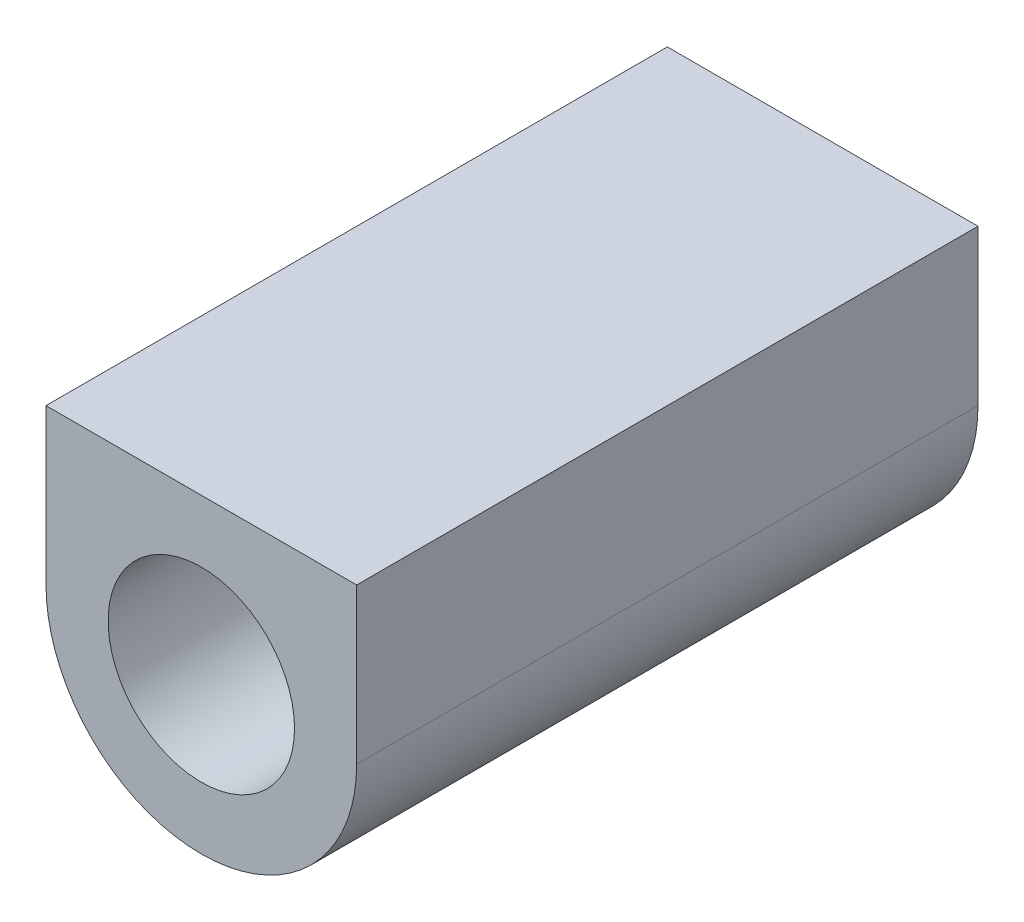
ISO-10303-21;
HEADER;
FILE_DESCRIPTION(('STEP AP214'),'2;1');
FILE_NAME('part.step','',(''),(''),'','','');
FILE_SCHEMA(('AUTOMOTIVE_DESIGN { 1 0 10303 214 1 1 1 1 }'));
ENDSEC;
DATA;
#1=APPLICATION_CONTEXT('core data for automotive mechanical design processes');
#2=APPLICATION_PROTOCOL_DEFINITION('international standard','automotive_design',2000,#1);
#3=PRODUCT_CONTEXT('',#1,'mechanical');
#4=PRODUCT('Part','Part','',(#3));
#5=PRODUCT_RELATED_PRODUCT_CATEGORY('part','',(#4));
#6=PRODUCT_DEFINITION_FORMATION('','',#4);
#7=PRODUCT_DEFINITION_CONTEXT('part definition',#1,'design');
#8=PRODUCT_DEFINITION('design','',#6,#7);
#9=PRODUCT_DEFINITION_SHAPE('','',#8);
#10=(LENGTH_UNIT() NAMED_UNIT(*) SI_UNIT(.MILLI.,.METRE.));
#11=(NAMED_UNIT(*) PLANE_ANGLE_UNIT() SI_UNIT($,.RADIAN.));
#12=(NAMED_UNIT(*) SI_UNIT($,.STERADIAN.) SOLID_ANGLE_UNIT());
#13=UNCERTAINTY_MEASURE_WITH_UNIT(LENGTH_MEASURE(1.E-05),#10,'distance_accuracy_value','');
#14=(GEOMETRIC_REPRESENTATION_CONTEXT(3) GLOBAL_UNCERTAINTY_ASSIGNED_CONTEXT((#13)) GLOBAL_UNIT_ASSIGNED_CONTEXT((#10,
#11,#12)) REPRESENTATION_CONTEXT('',''));
#15=CARTESIAN_POINT('',(0.,0.,0.));
#16=DIRECTION('',(0.,0.,1.));
#17=DIRECTION('',(1.,0.,0.));
#18=AXIS2_PLACEMENT_3D('',#15,#16,#17);
#19=CARTESIAN_POINT('',(0.,0.,10.));
#20=DIRECTION('',(0.,0.,-1.));
#21=DIRECTION('',(-1.,0.,0.));
#22=AXIS2_PLACEMENT_3D('',#19,#20,#21);
#23=PLANE('',#22);
#24=CARTESIAN_POINT('',(2.5,2.5,10.));
#25=DIRECTION('',(0.,0.,1.));
#26=DIRECTION('',(1.,0.,0.));
#27=AXIS2_PLACEMENT_3D('',#24,#25,#26);
#28=CIRCLE('',#27,1.5);
#29=CARTESIAN_POINT('',(4.,2.5,10.));
#30=VERTEX_POINT('',#29);
#31=EDGE_CURVE('E143',#30,#30,#28,.T.);
#32=ORIENTED_EDGE('',*,*,#31,.F.);
#33=EDGE_LOOP('',(#32));
#34=FACE_BOUND('',#33,.T.);
#35=DIRECTION('',(0.,-1.,0.));
#36=VECTOR('',#35,1.);
#37=CARTESIAN_POINT('',(0.,0.,10.));
#38=LINE('',#37,#36);
#39=CARTESIAN_POINT('',(0.,5.,10.));
#40=VERTEX_POINT('',#39);
#41=CARTESIAN_POINT('',(0.,2.5,10.));
#42=VERTEX_POINT('',#41);
#43=EDGE_CURVE('E148',#40,#42,#38,.T.);
#44=ORIENTED_EDGE('',*,*,#43,.T.);
#45=CARTESIAN_POINT('',(2.5,2.5,10.));
#46=DIRECTION('',(0.,0.,1.));
#47=DIRECTION('',(1.,0.,0.));
#48=AXIS2_PLACEMENT_3D('',#45,#46,#47);
#49=CIRCLE('',#48,2.5);
#50=CARTESIAN_POINT('',(5.,2.5,10.));
#51=VERTEX_POINT('',#50);
#52=EDGE_CURVE('E128',#42,#51,#49,.T.);
#53=ORIENTED_EDGE('',*,*,#52,.T.);
#54=DIRECTION('',(0.,1.,0.));
#55=VECTOR('',#54,1.);
#56=CARTESIAN_POINT('',(5.,0.,10.));
#57=LINE('',#56,#55);
#58=CARTESIAN_POINT('',(5.,5.,10.));
#59=VERTEX_POINT('',#58);
#60=EDGE_CURVE('E149',#51,#59,#57,.T.);
#61=ORIENTED_EDGE('',*,*,#60,.T.);
#62=DIRECTION('',(-1.,0.,0.));
#63=VECTOR('',#62,1.);
#64=CARTESIAN_POINT('',(0.,5.,10.));
#65=LINE('',#64,#63);
#66=EDGE_CURVE('E95',#59,#40,#65,.T.);
#67=ORIENTED_EDGE('',*,*,#66,.T.);
#68=EDGE_LOOP('',(#44,#53,#61,#67));
#69=FACE_BOUND('',#68,.T.);
#70=ADVANCED_FACE('F78',(#34,#69),#23,.F.);
#71=CARTESIAN_POINT('',(0.,0.,0.));
#72=DIRECTION('',(0.,0.,-1.));
#73=DIRECTION('',(-1.,0.,0.));
#74=AXIS2_PLACEMENT_3D('',#71,#72,#73);
#75=PLANE('',#74);
#76=CARTESIAN_POINT('',(2.5,2.5,0.));
#77=DIRECTION('',(0.,0.,1.));
#78=DIRECTION('',(1.,0.,0.));
#79=AXIS2_PLACEMENT_3D('',#76,#77,#78);
#80=CIRCLE('',#79,1.5);
#81=CARTESIAN_POINT('',(4.,2.5,0.));
#82=VERTEX_POINT('',#81);
#83=EDGE_CURVE('E138',#82,#82,#80,.T.);
#84=ORIENTED_EDGE('',*,*,#83,.T.);
#85=EDGE_LOOP('',(#84));
#86=FACE_BOUND('',#85,.T.);
#87=CARTESIAN_POINT('',(2.5,2.5,0.));
#88=DIRECTION('',(0.,0.,1.));
#89=DIRECTION('',(1.,0.,0.));
#90=AXIS2_PLACEMENT_3D('',#87,#88,#89);
#91=CIRCLE('',#90,2.5);
#92=CARTESIAN_POINT('',(0.,2.5,0.));
#93=VERTEX_POINT('',#92);
#94=CARTESIAN_POINT('',(5.,2.5,0.));
#95=VERTEX_POINT('',#94);
#96=EDGE_CURVE('E115',#93,#95,#91,.T.);
#97=ORIENTED_EDGE('',*,*,#96,.F.);
#98=DIRECTION('',(0.,-1.,0.));
#99=VECTOR('',#98,1.);
#100=CARTESIAN_POINT('',(0.,0.,0.));
#101=LINE('',#100,#99);
#102=CARTESIAN_POINT('',(0.,5.,0.));
#103=VERTEX_POINT('',#102);
#104=EDGE_CURVE('E126',#103,#93,#101,.T.);
#105=ORIENTED_EDGE('',*,*,#104,.F.);
#106=DIRECTION('',(-1.,0.,0.));
#107=VECTOR('',#106,1.);
#108=CARTESIAN_POINT('',(0.,5.,0.));
#109=LINE('',#108,#107);
#110=CARTESIAN_POINT('',(5.,5.,0.));
#111=VERTEX_POINT('',#110);
#112=EDGE_CURVE('E140',#111,#103,#109,.T.);
#113=ORIENTED_EDGE('',*,*,#112,.F.);
#114=DIRECTION('',(0.,1.,0.));
#115=VECTOR('',#114,1.);
#116=CARTESIAN_POINT('',(5.,0.,0.));
#117=LINE('',#116,#115);
#118=EDGE_CURVE('E106',#95,#111,#117,.T.);
#119=ORIENTED_EDGE('',*,*,#118,.F.);
#120=EDGE_LOOP('',(#97,#105,#113,#119));
#121=FACE_BOUND('',#120,.T.);
#122=ADVANCED_FACE('F123',(#86,#121),#75,.T.);
#123=CARTESIAN_POINT('',(5.,0.,10.));
#124=DIRECTION('',(-1.,0.,0.));
#125=DIRECTION('',(0.,0.,1.));
#126=AXIS2_PLACEMENT_3D('',#123,#124,#125);
#127=PLANE('',#126);
#128=DIRECTION('',(0.,0.,1.));
#129=VECTOR('',#128,1.);
#130=CARTESIAN_POINT('',(5.,2.5,0.));
#131=LINE('',#130,#129);
#132=EDGE_CURVE('E127',#95,#51,#131,.T.);
#133=ORIENTED_EDGE('',*,*,#132,.F.);
#134=ORIENTED_EDGE('',*,*,#118,.T.);
#135=DIRECTION('',(0.,0.,-1.));
#136=VECTOR('',#135,1.);
#137=CARTESIAN_POINT('',(5.,5.,10.));
#138=LINE('',#137,#136);
#139=EDGE_CURVE('E12',#59,#111,#138,.T.);
#140=ORIENTED_EDGE('',*,*,#139,.F.);
#141=ORIENTED_EDGE('',*,*,#60,.F.);
#142=EDGE_LOOP('',(#133,#134,#140,#141));
#143=FACE_BOUND('',#142,.T.);
#144=ADVANCED_FACE('F156',(#143),#127,.F.);
#145=CARTESIAN_POINT('',(0.,0.,10.));
#146=DIRECTION('',(1.,0.,0.));
#147=DIRECTION('',(0.,0.,-1.));
#148=AXIS2_PLACEMENT_3D('',#145,#146,#147);
#149=PLANE('',#148);
#150=ORIENTED_EDGE('',*,*,#104,.T.);
#151=DIRECTION('',(0.,0.,1.));
#152=VECTOR('',#151,1.);
#153=CARTESIAN_POINT('',(0.,2.5,0.));
#154=LINE('',#153,#152);
#155=EDGE_CURVE('E131',#93,#42,#154,.T.);
#156=ORIENTED_EDGE('',*,*,#155,.T.);
#157=ORIENTED_EDGE('',*,*,#43,.F.);
#158=DIRECTION('',(0.,0.,-1.));
#159=VECTOR('',#158,1.);
#160=CARTESIAN_POINT('',(0.,5.,10.));
#161=LINE('',#160,#159);
#162=EDGE_CURVE('E87',#40,#103,#161,.T.);
#163=ORIENTED_EDGE('',*,*,#162,.T.);
#164=EDGE_LOOP('',(#150,#156,#157,#163));
#165=FACE_BOUND('',#164,.T.);
#166=ADVANCED_FACE('F80',(#165),#149,.F.);
#167=CARTESIAN_POINT('',(0.,5.,10.));
#168=DIRECTION('',(0.,-1.,0.));
#169=DIRECTION('',(0.,0.,-1.));
#170=AXIS2_PLACEMENT_3D('',#167,#168,#169);
#171=PLANE('',#170);
#172=ORIENTED_EDGE('',*,*,#112,.T.);
#173=ORIENTED_EDGE('',*,*,#162,.F.);
#174=ORIENTED_EDGE('',*,*,#66,.F.);
#175=ORIENTED_EDGE('',*,*,#139,.T.);
#176=EDGE_LOOP('',(#172,#173,#174,#175));
#177=FACE_BOUND('',#176,.T.);
#178=ADVANCED_FACE('F158',(#177),#171,.F.);
#179=CARTESIAN_POINT('',(2.5,2.5,0.));
#180=DIRECTION('',(0.,0.,1.));
#181=DIRECTION('',(1.,0.,0.));
#182=AXIS2_PLACEMENT_3D('',#179,#180,#181);
#183=CYLINDRICAL_SURFACE('',#182,1.5);
#184=ORIENTED_EDGE('',*,*,#83,.F.);
#185=EDGE_LOOP('',(#184));
#186=FACE_BOUND('',#185,.T.);
#187=ORIENTED_EDGE('',*,*,#31,.T.);
#188=EDGE_LOOP('',(#187));
#189=FACE_BOUND('',#188,.T.);
#190=ADVANCED_FACE('F160',(#186,#189),#183,.F.);
#191=CARTESIAN_POINT('',(2.5,2.5,0.));
#192=DIRECTION('',(0.,0.,1.));
#193=DIRECTION('',(1.,0.,0.));
#194=AXIS2_PLACEMENT_3D('',#191,#192,#193);
#195=CYLINDRICAL_SURFACE('',#194,2.5);
#196=ORIENTED_EDGE('',*,*,#52,.F.);
#197=ORIENTED_EDGE('',*,*,#155,.F.);
#198=ORIENTED_EDGE('',*,*,#96,.T.);
#199=ORIENTED_EDGE('',*,*,#132,.T.);
#200=EDGE_LOOP('',(#196,#197,#198,#199));
#201=FACE_BOUND('',#200,.T.);
#202=ADVANCED_FACE('F132',(#201),#195,.T.);
#203=CLOSED_SHELL('',(#70,#122,#144,#166,#178,#190,#202));
#204=MANIFOLD_SOLID_BREP('B2',#203);
#205=ADVANCED_BREP_SHAPE_REPRESENTATION('',(#18,#204),#14);
#206=SHAPE_DEFINITION_REPRESENTATION(#9,#205);
ENDSEC;
END-ISO-10303-21;
